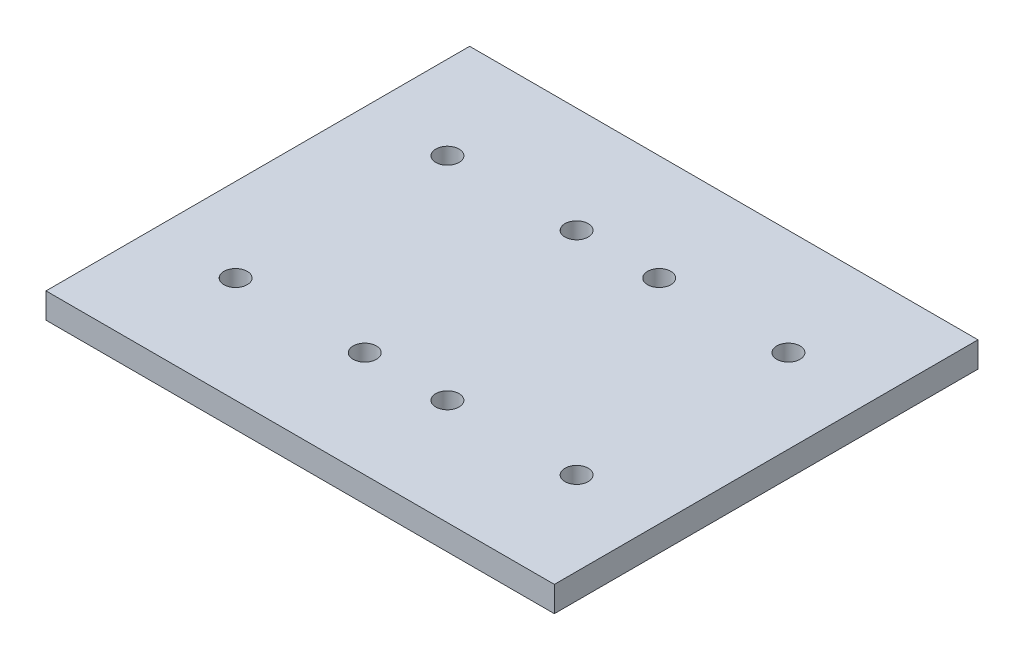
ISO-10303-21;
HEADER;
FILE_DESCRIPTION(('STEP AP214'),'2;1');
FILE_NAME('part.step','',(''),(''),'','','');
FILE_SCHEMA(('AUTOMOTIVE_DESIGN { 1 0 10303 214 1 1 1 1 }'));
ENDSEC;
DATA;
#1=APPLICATION_CONTEXT('core data for automotive mechanical design processes');
#2=APPLICATION_PROTOCOL_DEFINITION('international standard','automotive_design',2000,#1);
#3=PRODUCT_CONTEXT('',#1,'mechanical');
#4=PRODUCT('Part','Part','',(#3));
#5=PRODUCT_RELATED_PRODUCT_CATEGORY('part','',(#4));
#6=PRODUCT_DEFINITION_FORMATION('','',#4);
#7=PRODUCT_DEFINITION_CONTEXT('part definition',#1,'design');
#8=PRODUCT_DEFINITION('design','',#6,#7);
#9=PRODUCT_DEFINITION_SHAPE('','',#8);
#10=(LENGTH_UNIT() NAMED_UNIT(*) SI_UNIT(.MILLI.,.METRE.));
#11=(NAMED_UNIT(*) PLANE_ANGLE_UNIT() SI_UNIT($,.RADIAN.));
#12=(NAMED_UNIT(*) SI_UNIT($,.STERADIAN.) SOLID_ANGLE_UNIT());
#13=UNCERTAINTY_MEASURE_WITH_UNIT(LENGTH_MEASURE(1.E-05),#10,'distance_accuracy_value','');
#14=(GEOMETRIC_REPRESENTATION_CONTEXT(3) GLOBAL_UNCERTAINTY_ASSIGNED_CONTEXT((#13)) GLOBAL_UNIT_ASSIGNED_CONTEXT((#10,
#11,#12)) REPRESENTATION_CONTEXT('',''));
#15=CARTESIAN_POINT('',(0.,0.,0.));
#16=DIRECTION('',(0.,0.,1.));
#17=DIRECTION('',(1.,0.,0.));
#18=AXIS2_PLACEMENT_3D('',#15,#16,#17);
#19=CARTESIAN_POINT('',(60.,6.,-50.));
#20=DIRECTION('',(-1.,0.,0.));
#21=DIRECTION('',(0.,0.,1.));
#22=AXIS2_PLACEMENT_3D('',#19,#20,#21);
#23=PLANE('',#22);
#24=DIRECTION('',(0.,0.,-1.));
#25=VECTOR('',#24,1.);
#26=CARTESIAN_POINT('',(60.,0.,-50.));
#27=LINE('',#26,#25);
#28=CARTESIAN_POINT('',(60.,0.,50.));
#29=VERTEX_POINT('',#28);
#30=CARTESIAN_POINT('',(60.,0.,-50.));
#31=VERTEX_POINT('',#30);
#32=EDGE_CURVE('E98',#29,#31,#27,.T.);
#33=ORIENTED_EDGE('',*,*,#32,.T.);
#34=DIRECTION('',(0.,-1.,0.));
#35=VECTOR('',#34,1.);
#36=CARTESIAN_POINT('',(60.,6.,-50.));
#37=LINE('',#36,#35);
#38=CARTESIAN_POINT('',(60.,6.,-50.));
#39=VERTEX_POINT('',#38);
#40=EDGE_CURVE('E11',#39,#31,#37,.T.);
#41=ORIENTED_EDGE('',*,*,#40,.F.);
#42=DIRECTION('',(0.,0.,-1.));
#43=VECTOR('',#42,1.);
#44=CARTESIAN_POINT('',(60.,6.,-50.));
#45=LINE('',#44,#43);
#46=CARTESIAN_POINT('',(60.,6.,50.));
#47=VERTEX_POINT('',#46);
#48=EDGE_CURVE('E86',#47,#39,#45,.T.);
#49=ORIENTED_EDGE('',*,*,#48,.F.);
#50=DIRECTION('',(0.,-1.,0.));
#51=VECTOR('',#50,1.);
#52=CARTESIAN_POINT('',(60.,6.,50.));
#53=LINE('',#52,#51);
#54=EDGE_CURVE('E94',#47,#29,#53,.T.);
#55=ORIENTED_EDGE('',*,*,#54,.T.);
#56=EDGE_LOOP('',(#33,#41,#49,#55));
#57=FACE_BOUND('',#56,.T.);
#58=ADVANCED_FACE('F35',(#57),#23,.F.);
#59=CARTESIAN_POINT('',(-60.,6.,-50.));
#60=DIRECTION('',(0.,0.,1.));
#61=DIRECTION('',(1.,0.,0.));
#62=AXIS2_PLACEMENT_3D('',#59,#60,#61);
#63=PLANE('',#62);
#64=DIRECTION('',(-1.,0.,0.));
#65=VECTOR('',#64,1.);
#66=CARTESIAN_POINT('',(-60.,0.,-50.));
#67=LINE('',#66,#65);
#68=CARTESIAN_POINT('',(-60.,0.,-50.));
#69=VERTEX_POINT('',#68);
#70=EDGE_CURVE('E90',#31,#69,#67,.T.);
#71=ORIENTED_EDGE('',*,*,#70,.T.);
#72=DIRECTION('',(0.,-1.,0.));
#73=VECTOR('',#72,1.);
#74=CARTESIAN_POINT('',(-60.,6.,-50.));
#75=LINE('',#74,#73);
#76=CARTESIAN_POINT('',(-60.,6.,-50.));
#77=VERTEX_POINT('',#76);
#78=EDGE_CURVE('E43',#77,#69,#75,.T.);
#79=ORIENTED_EDGE('',*,*,#78,.F.);
#80=DIRECTION('',(-1.,0.,0.));
#81=VECTOR('',#80,1.);
#82=CARTESIAN_POINT('',(-60.,6.,-50.));
#83=LINE('',#82,#81);
#84=EDGE_CURVE('E81',#39,#77,#83,.T.);
#85=ORIENTED_EDGE('',*,*,#84,.F.);
#86=ORIENTED_EDGE('',*,*,#40,.T.);
#87=EDGE_LOOP('',(#71,#79,#85,#86));
#88=FACE_BOUND('',#87,.T.);
#89=ADVANCED_FACE('F89',(#88),#63,.F.);
#90=CARTESIAN_POINT('',(-60.,6.,-50.));
#91=DIRECTION('',(1.,0.,0.));
#92=DIRECTION('',(0.,0.,-1.));
#93=AXIS2_PLACEMENT_3D('',#90,#91,#92);
#94=PLANE('',#93);
#95=DIRECTION('',(0.,0.,1.));
#96=VECTOR('',#95,1.);
#97=CARTESIAN_POINT('',(-60.,0.,-50.));
#98=LINE('',#97,#96);
#99=CARTESIAN_POINT('',(-60.,0.,50.));
#100=VERTEX_POINT('',#99);
#101=EDGE_CURVE('E68',#69,#100,#98,.T.);
#102=ORIENTED_EDGE('',*,*,#101,.T.);
#103=DIRECTION('',(0.,-1.,0.));
#104=VECTOR('',#103,1.);
#105=CARTESIAN_POINT('',(-60.,6.,50.));
#106=LINE('',#105,#104);
#107=CARTESIAN_POINT('',(-60.,6.,50.));
#108=VERTEX_POINT('',#107);
#109=EDGE_CURVE('E91',#108,#100,#106,.T.);
#110=ORIENTED_EDGE('',*,*,#109,.F.);
#111=DIRECTION('',(0.,0.,1.));
#112=VECTOR('',#111,1.);
#113=CARTESIAN_POINT('',(-60.,6.,-50.));
#114=LINE('',#113,#112);
#115=EDGE_CURVE('E84',#77,#108,#114,.T.);
#116=ORIENTED_EDGE('',*,*,#115,.F.);
#117=ORIENTED_EDGE('',*,*,#78,.T.);
#118=EDGE_LOOP('',(#102,#110,#116,#117));
#119=FACE_BOUND('',#118,.T.);
#120=ADVANCED_FACE('F92',(#119),#94,.F.);
#121=CARTESIAN_POINT('',(-60.,6.,50.));
#122=DIRECTION('',(0.,0.,-1.));
#123=DIRECTION('',(-1.,0.,0.));
#124=AXIS2_PLACEMENT_3D('',#121,#122,#123);
#125=PLANE('',#124);
#126=DIRECTION('',(1.,0.,0.));
#127=VECTOR('',#126,1.);
#128=CARTESIAN_POINT('',(-60.,0.,50.));
#129=LINE('',#128,#127);
#130=EDGE_CURVE('E74',#100,#29,#129,.T.);
#131=ORIENTED_EDGE('',*,*,#130,.T.);
#132=ORIENTED_EDGE('',*,*,#54,.F.);
#133=DIRECTION('',(1.,0.,0.));
#134=VECTOR('',#133,1.);
#135=CARTESIAN_POINT('',(-60.,6.,50.));
#136=LINE('',#135,#134);
#137=EDGE_CURVE('E51',#108,#47,#136,.T.);
#138=ORIENTED_EDGE('',*,*,#137,.F.);
#139=ORIENTED_EDGE('',*,*,#109,.T.);
#140=EDGE_LOOP('',(#131,#132,#138,#139));
#141=FACE_BOUND('',#140,.T.);
#142=ADVANCED_FACE('F106',(#141),#125,.F.);
#143=CARTESIAN_POINT('',(0.,6.,0.));
#144=DIRECTION('',(0.,1.,0.));
#145=DIRECTION('',(0.,0.,1.));
#146=AXIS2_PLACEMENT_3D('',#143,#144,#145);
#147=PLANE('',#146);
#148=CARTESIAN_POINT('',(-40.25,6.,25.));
#149=DIRECTION('',(0.,1.,0.));
#150=DIRECTION('',(0.,0.,-1.));
#151=AXIS2_PLACEMENT_3D('',#148,#149,#150);
#152=CIRCLE('',#151,2.75);
#153=CARTESIAN_POINT('',(-40.25,6.,22.25));
#154=VERTEX_POINT('',#153);
#155=EDGE_CURVE('E130',#154,#154,#152,.T.);
#156=ORIENTED_EDGE('',*,*,#155,.F.);
#157=EDGE_LOOP('',(#156));
#158=FACE_BOUND('',#157,.T.);
#159=CARTESIAN_POINT('',(40.25,6.,25.));
#160=DIRECTION('',(0.,1.,0.));
#161=DIRECTION('',(0.,0.,1.));
#162=AXIS2_PLACEMENT_3D('',#159,#160,#161);
#163=CIRCLE('',#162,2.75);
#164=CARTESIAN_POINT('',(40.25,6.,27.75));
#165=VERTEX_POINT('',#164);
#166=EDGE_CURVE('E137',#165,#165,#163,.T.);
#167=ORIENTED_EDGE('',*,*,#166,.F.);
#168=EDGE_LOOP('',(#167));
#169=FACE_BOUND('',#168,.T.);
#170=CARTESIAN_POINT('',(9.75000000000001,6.,25.));
#171=DIRECTION('',(0.,1.,0.));
#172=DIRECTION('',(0.,0.,1.));
#173=AXIS2_PLACEMENT_3D('',#170,#171,#172);
#174=CIRCLE('',#173,2.75);
#175=CARTESIAN_POINT('',(9.75000000000001,6.,27.75));
#176=VERTEX_POINT('',#175);
#177=EDGE_CURVE('E118',#176,#176,#174,.T.);
#178=ORIENTED_EDGE('',*,*,#177,.F.);
#179=EDGE_LOOP('',(#178));
#180=FACE_BOUND('',#179,.T.);
#181=CARTESIAN_POINT('',(40.25,6.,-25.));
#182=DIRECTION('',(0.,1.,0.));
#183=DIRECTION('',(0.,0.,1.));
#184=AXIS2_PLACEMENT_3D('',#181,#182,#183);
#185=CIRCLE('',#184,2.74999999999999);
#186=CARTESIAN_POINT('',(40.25,6.,-22.25));
#187=VERTEX_POINT('',#186);
#188=EDGE_CURVE('E125',#187,#187,#185,.T.);
#189=ORIENTED_EDGE('',*,*,#188,.F.);
#190=EDGE_LOOP('',(#189));
#191=FACE_BOUND('',#190,.T.);
#192=CARTESIAN_POINT('',(-9.75,6.,-25.));
#193=DIRECTION('',(0.,1.,0.));
#194=DIRECTION('',(0.,0.,-1.));
#195=AXIS2_PLACEMENT_3D('',#192,#193,#194);
#196=CIRCLE('',#195,2.75);
#197=CARTESIAN_POINT('',(-9.75,6.,-27.75));
#198=VERTEX_POINT('',#197);
#199=EDGE_CURVE('E154',#198,#198,#196,.T.);
#200=ORIENTED_EDGE('',*,*,#199,.F.);
#201=EDGE_LOOP('',(#200));
#202=FACE_BOUND('',#201,.T.);
#203=CARTESIAN_POINT('',(-40.25,6.,-25.));
#204=DIRECTION('',(0.,1.,0.));
#205=DIRECTION('',(0.,0.,-1.));
#206=AXIS2_PLACEMENT_3D('',#203,#204,#205);
#207=CIRCLE('',#206,2.74999999999999);
#208=CARTESIAN_POINT('',(-40.25,6.,-27.75));
#209=VERTEX_POINT('',#208);
#210=EDGE_CURVE('E142',#209,#209,#207,.T.);
#211=ORIENTED_EDGE('',*,*,#210,.F.);
#212=EDGE_LOOP('',(#211));
#213=FACE_BOUND('',#212,.T.);
#214=CARTESIAN_POINT('',(-9.75000000000001,6.,25.));
#215=DIRECTION('',(0.,1.,0.));
#216=DIRECTION('',(0.,0.,-1.));
#217=AXIS2_PLACEMENT_3D('',#214,#215,#216);
#218=CIRCLE('',#217,2.75);
#219=CARTESIAN_POINT('',(-9.75000000000001,6.,22.25));
#220=VERTEX_POINT('',#219);
#221=EDGE_CURVE('E149',#220,#220,#218,.T.);
#222=ORIENTED_EDGE('',*,*,#221,.F.);
#223=EDGE_LOOP('',(#222));
#224=FACE_BOUND('',#223,.T.);
#225=CARTESIAN_POINT('',(9.75,6.,-25.));
#226=DIRECTION('',(0.,1.,0.));
#227=DIRECTION('',(0.,0.,1.));
#228=AXIS2_PLACEMENT_3D('',#225,#226,#227);
#229=CIRCLE('',#228,2.75);
#230=CARTESIAN_POINT('',(9.75,6.,-22.25));
#231=VERTEX_POINT('',#230);
#232=EDGE_CURVE('E112',#231,#231,#229,.T.);
#233=ORIENTED_EDGE('',*,*,#232,.F.);
#234=EDGE_LOOP('',(#233));
#235=FACE_BOUND('',#234,.T.);
#236=ORIENTED_EDGE('',*,*,#48,.T.);
#237=ORIENTED_EDGE('',*,*,#84,.T.);
#238=ORIENTED_EDGE('',*,*,#115,.T.);
#239=ORIENTED_EDGE('',*,*,#137,.T.);
#240=EDGE_LOOP('',(#236,#237,#238,#239));
#241=FACE_BOUND('',#240,.T.);
#242=ADVANCED_FACE('F82',(#158,#169,#180,#191,#202,#213,#224,#235,#241),#147,.T.);
#243=CARTESIAN_POINT('',(0.,0.,0.));
#244=DIRECTION('',(0.,1.,0.));
#245=DIRECTION('',(0.,0.,1.));
#246=AXIS2_PLACEMENT_3D('',#243,#244,#245);
#247=PLANE('',#246);
#248=CARTESIAN_POINT('',(-40.25,0.,25.));
#249=DIRECTION('',(0.,1.,0.));
#250=DIRECTION('',(0.,0.,-1.));
#251=AXIS2_PLACEMENT_3D('',#248,#249,#250);
#252=CIRCLE('',#251,2.75);
#253=CARTESIAN_POINT('',(-40.25,0.,22.25));
#254=VERTEX_POINT('',#253);
#255=EDGE_CURVE('E133',#254,#254,#252,.T.);
#256=ORIENTED_EDGE('',*,*,#255,.T.);
#257=EDGE_LOOP('',(#256));
#258=FACE_BOUND('',#257,.T.);
#259=CARTESIAN_POINT('',(40.25,0.,25.));
#260=DIRECTION('',(0.,1.,0.));
#261=DIRECTION('',(0.,0.,1.));
#262=AXIS2_PLACEMENT_3D('',#259,#260,#261);
#263=CIRCLE('',#262,2.75);
#264=CARTESIAN_POINT('',(40.25,0.,27.75));
#265=VERTEX_POINT('',#264);
#266=EDGE_CURVE('E122',#265,#265,#263,.T.);
#267=ORIENTED_EDGE('',*,*,#266,.T.);
#268=EDGE_LOOP('',(#267));
#269=FACE_BOUND('',#268,.T.);
#270=CARTESIAN_POINT('',(9.75000000000001,0.,25.));
#271=DIRECTION('',(0.,1.,0.));
#272=DIRECTION('',(0.,0.,1.));
#273=AXIS2_PLACEMENT_3D('',#270,#271,#272);
#274=CIRCLE('',#273,2.75);
#275=CARTESIAN_POINT('',(9.75000000000001,0.,27.75));
#276=VERTEX_POINT('',#275);
#277=EDGE_CURVE('E121',#276,#276,#274,.T.);
#278=ORIENTED_EDGE('',*,*,#277,.T.);
#279=EDGE_LOOP('',(#278));
#280=FACE_BOUND('',#279,.T.);
#281=CARTESIAN_POINT('',(40.25,0.,-25.));
#282=DIRECTION('',(0.,1.,0.));
#283=DIRECTION('',(0.,0.,1.));
#284=AXIS2_PLACEMENT_3D('',#281,#282,#283);
#285=CIRCLE('',#284,2.74999999999999);
#286=CARTESIAN_POINT('',(40.25,0.,-22.25));
#287=VERTEX_POINT('',#286);
#288=EDGE_CURVE('E115',#287,#287,#285,.T.);
#289=ORIENTED_EDGE('',*,*,#288,.T.);
#290=EDGE_LOOP('',(#289));
#291=FACE_BOUND('',#290,.T.);
#292=CARTESIAN_POINT('',(-9.75,0.,-25.));
#293=DIRECTION('',(0.,1.,0.));
#294=DIRECTION('',(0.,0.,-1.));
#295=AXIS2_PLACEMENT_3D('',#292,#293,#294);
#296=CIRCLE('',#295,2.75);
#297=CARTESIAN_POINT('',(-9.75,0.,-27.75));
#298=VERTEX_POINT('',#297);
#299=EDGE_CURVE('E146',#298,#298,#296,.T.);
#300=ORIENTED_EDGE('',*,*,#299,.T.);
#301=EDGE_LOOP('',(#300));
#302=FACE_BOUND('',#301,.T.);
#303=CARTESIAN_POINT('',(-40.25,0.,-25.));
#304=DIRECTION('',(0.,1.,0.));
#305=DIRECTION('',(0.,0.,-1.));
#306=AXIS2_PLACEMENT_3D('',#303,#304,#305);
#307=CIRCLE('',#306,2.74999999999999);
#308=CARTESIAN_POINT('',(-40.25,0.,-27.75));
#309=VERTEX_POINT('',#308);
#310=EDGE_CURVE('E145',#309,#309,#307,.T.);
#311=ORIENTED_EDGE('',*,*,#310,.T.);
#312=EDGE_LOOP('',(#311));
#313=FACE_BOUND('',#312,.T.);
#314=CARTESIAN_POINT('',(-9.75000000000001,0.,25.));
#315=DIRECTION('',(0.,1.,0.));
#316=DIRECTION('',(0.,0.,-1.));
#317=AXIS2_PLACEMENT_3D('',#314,#315,#316);
#318=CIRCLE('',#317,2.75);
#319=CARTESIAN_POINT('',(-9.75000000000001,0.,22.25));
#320=VERTEX_POINT('',#319);
#321=EDGE_CURVE('E134',#320,#320,#318,.T.);
#322=ORIENTED_EDGE('',*,*,#321,.T.);
#323=EDGE_LOOP('',(#322));
#324=FACE_BOUND('',#323,.T.);
#325=CARTESIAN_POINT('',(9.75,0.,-25.));
#326=DIRECTION('',(0.,1.,0.));
#327=DIRECTION('',(0.,0.,1.));
#328=AXIS2_PLACEMENT_3D('',#325,#326,#327);
#329=CIRCLE('',#328,2.75);
#330=CARTESIAN_POINT('',(9.75,0.,-22.25));
#331=VERTEX_POINT('',#330);
#332=EDGE_CURVE('E101',#331,#331,#329,.T.);
#333=ORIENTED_EDGE('',*,*,#332,.T.);
#334=EDGE_LOOP('',(#333));
#335=FACE_BOUND('',#334,.T.);
#336=ORIENTED_EDGE('',*,*,#32,.F.);
#337=ORIENTED_EDGE('',*,*,#130,.F.);
#338=ORIENTED_EDGE('',*,*,#101,.F.);
#339=ORIENTED_EDGE('',*,*,#70,.F.);
#340=EDGE_LOOP('',(#336,#337,#338,#339));
#341=FACE_BOUND('',#340,.T.);
#342=ADVANCED_FACE('F109',(#258,#269,#280,#291,#302,#313,#324,#335,#341),#247,.F.);
#343=CARTESIAN_POINT('',(9.75,0.,-25.));
#344=DIRECTION('',(0.,1.,0.));
#345=DIRECTION('',(0.,0.,1.));
#346=AXIS2_PLACEMENT_3D('',#343,#344,#345);
#347=CYLINDRICAL_SURFACE('',#346,2.75);
#348=ORIENTED_EDGE('',*,*,#332,.F.);
#349=EDGE_LOOP('',(#348));
#350=FACE_BOUND('',#349,.T.);
#351=ORIENTED_EDGE('',*,*,#232,.T.);
#352=EDGE_LOOP('',(#351));
#353=FACE_BOUND('',#352,.T.);
#354=ADVANCED_FACE('F180',(#350,#353),#347,.F.);
#355=CARTESIAN_POINT('',(-9.75000000000001,0.,25.));
#356=DIRECTION('',(0.,1.,0.));
#357=DIRECTION('',(0.,0.,1.));
#358=AXIS2_PLACEMENT_3D('',#355,#356,#357);
#359=CYLINDRICAL_SURFACE('',#358,2.75);
#360=ORIENTED_EDGE('',*,*,#321,.F.);
#361=EDGE_LOOP('',(#360));
#362=FACE_BOUND('',#361,.T.);
#363=ORIENTED_EDGE('',*,*,#221,.T.);
#364=EDGE_LOOP('',(#363));
#365=FACE_BOUND('',#364,.T.);
#366=ADVANCED_FACE('F182',(#362,#365),#359,.F.);
#367=CARTESIAN_POINT('',(-40.25,0.,-25.));
#368=DIRECTION('',(0.,1.,0.));
#369=DIRECTION('',(0.,0.,1.));
#370=AXIS2_PLACEMENT_3D('',#367,#368,#369);
#371=CYLINDRICAL_SURFACE('',#370,2.74999999999999);
#372=ORIENTED_EDGE('',*,*,#310,.F.);
#373=EDGE_LOOP('',(#372));
#374=FACE_BOUND('',#373,.T.);
#375=ORIENTED_EDGE('',*,*,#210,.T.);
#376=EDGE_LOOP('',(#375));
#377=FACE_BOUND('',#376,.T.);
#378=ADVANCED_FACE('F166',(#374,#377),#371,.F.);
#379=CARTESIAN_POINT('',(-9.75,0.,-25.));
#380=DIRECTION('',(0.,1.,0.));
#381=DIRECTION('',(0.,0.,1.));
#382=AXIS2_PLACEMENT_3D('',#379,#380,#381);
#383=CYLINDRICAL_SURFACE('',#382,2.75);
#384=ORIENTED_EDGE('',*,*,#299,.F.);
#385=EDGE_LOOP('',(#384));
#386=FACE_BOUND('',#385,.T.);
#387=ORIENTED_EDGE('',*,*,#199,.T.);
#388=EDGE_LOOP('',(#387));
#389=FACE_BOUND('',#388,.T.);
#390=ADVANCED_FACE('F162',(#386,#389),#383,.F.);
#391=CARTESIAN_POINT('',(40.25,0.,-25.));
#392=DIRECTION('',(0.,1.,0.));
#393=DIRECTION('',(0.,0.,1.));
#394=AXIS2_PLACEMENT_3D('',#391,#392,#393);
#395=CYLINDRICAL_SURFACE('',#394,2.74999999999999);
#396=ORIENTED_EDGE('',*,*,#288,.F.);
#397=EDGE_LOOP('',(#396));
#398=FACE_BOUND('',#397,.T.);
#399=ORIENTED_EDGE('',*,*,#188,.T.);
#400=EDGE_LOOP('',(#399));
#401=FACE_BOUND('',#400,.T.);
#402=ADVANCED_FACE('F165',(#398,#401),#395,.F.);
#403=CARTESIAN_POINT('',(9.75000000000001,0.,25.));
#404=DIRECTION('',(0.,1.,0.));
#405=DIRECTION('',(0.,0.,1.));
#406=AXIS2_PLACEMENT_3D('',#403,#404,#405);
#407=CYLINDRICAL_SURFACE('',#406,2.75);
#408=ORIENTED_EDGE('',*,*,#277,.F.);
#409=EDGE_LOOP('',(#408));
#410=FACE_BOUND('',#409,.T.);
#411=ORIENTED_EDGE('',*,*,#177,.T.);
#412=EDGE_LOOP('',(#411));
#413=FACE_BOUND('',#412,.T.);
#414=ADVANCED_FACE('F253',(#410,#413),#407,.F.);
#415=CARTESIAN_POINT('',(40.25,0.,25.));
#416=DIRECTION('',(0.,1.,0.));
#417=DIRECTION('',(0.,0.,1.));
#418=AXIS2_PLACEMENT_3D('',#415,#416,#417);
#419=CYLINDRICAL_SURFACE('',#418,2.75);
#420=ORIENTED_EDGE('',*,*,#266,.F.);
#421=EDGE_LOOP('',(#420));
#422=FACE_BOUND('',#421,.T.);
#423=ORIENTED_EDGE('',*,*,#166,.T.);
#424=EDGE_LOOP('',(#423));
#425=FACE_BOUND('',#424,.T.);
#426=ADVANCED_FACE('F263',(#422,#425),#419,.F.);
#427=CARTESIAN_POINT('',(-40.25,0.,25.));
#428=DIRECTION('',(0.,1.,0.));
#429=DIRECTION('',(0.,0.,1.));
#430=AXIS2_PLACEMENT_3D('',#427,#428,#429);
#431=CYLINDRICAL_SURFACE('',#430,2.75);
#432=ORIENTED_EDGE('',*,*,#255,.F.);
#433=EDGE_LOOP('',(#432));
#434=FACE_BOUND('',#433,.T.);
#435=ORIENTED_EDGE('',*,*,#155,.T.);
#436=EDGE_LOOP('',(#435));
#437=FACE_BOUND('',#436,.T.);
#438=ADVANCED_FACE('F272',(#434,#437),#431,.F.);
#439=CLOSED_SHELL('',(#58,#89,#120,#142,#242,#342,#354,#366,#378,#390,#402,#414,#426,#438));
#440=MANIFOLD_SOLID_BREP('B2',#439);
#441=ADVANCED_BREP_SHAPE_REPRESENTATION('',(#18,#440),#14);
#442=SHAPE_DEFINITION_REPRESENTATION(#9,#441);
ENDSEC;
END-ISO-10303-21;
